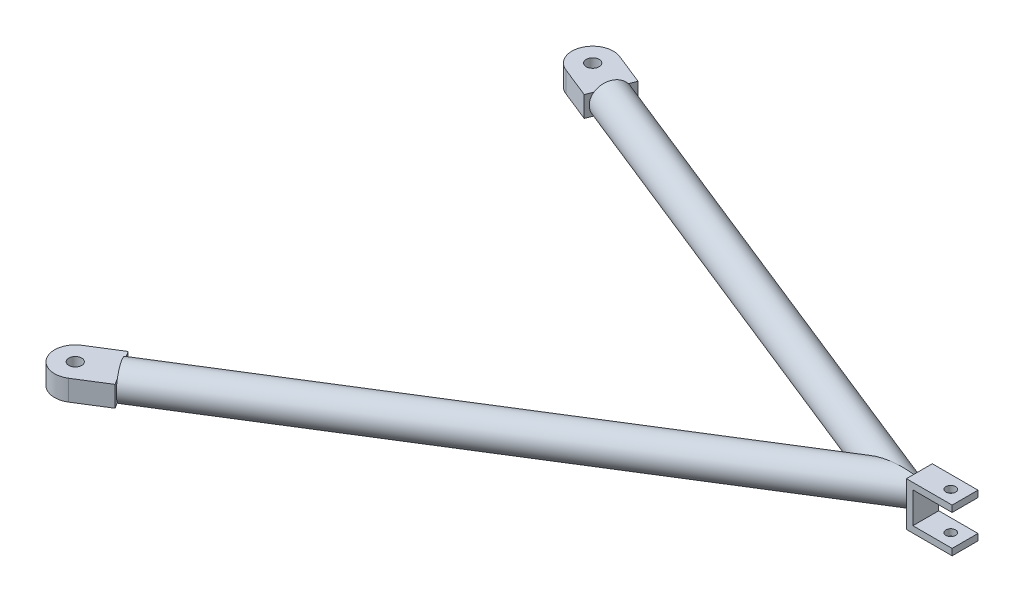
ISO-10303-21;
HEADER;
FILE_DESCRIPTION(('STEP AP214'),'2;1');
FILE_NAME('part.step','',(''),(''),'','','');
FILE_SCHEMA(('AUTOMOTIVE_DESIGN { 1 0 10303 214 1 1 1 1 }'));
ENDSEC;
DATA;
#1=APPLICATION_CONTEXT('core data for automotive mechanical design processes');
#2=APPLICATION_PROTOCOL_DEFINITION('international standard','automotive_design',2000,#1);
#3=PRODUCT_CONTEXT('',#1,'mechanical');
#4=PRODUCT('Part','Part','',(#3));
#5=PRODUCT_RELATED_PRODUCT_CATEGORY('part','',(#4));
#6=PRODUCT_DEFINITION_FORMATION('','',#4);
#7=PRODUCT_DEFINITION_CONTEXT('part definition',#1,'design');
#8=PRODUCT_DEFINITION('design','',#6,#7);
#9=PRODUCT_DEFINITION_SHAPE('','',#8);
#10=(LENGTH_UNIT() NAMED_UNIT(*) SI_UNIT(.MILLI.,.METRE.));
#11=(NAMED_UNIT(*) PLANE_ANGLE_UNIT() SI_UNIT($,.RADIAN.));
#12=(NAMED_UNIT(*) SI_UNIT($,.STERADIAN.) SOLID_ANGLE_UNIT());
#13=UNCERTAINTY_MEASURE_WITH_UNIT(LENGTH_MEASURE(1.E-05),#10,'distance_accuracy_value','');
#14=(GEOMETRIC_REPRESENTATION_CONTEXT(3) GLOBAL_UNCERTAINTY_ASSIGNED_CONTEXT((#13)) GLOBAL_UNIT_ASSIGNED_CONTEXT((#10,
#11,#12)) REPRESENTATION_CONTEXT('',''));
#15=CARTESIAN_POINT('',(0.,0.,0.));
#16=DIRECTION('',(0.,0.,1.));
#17=DIRECTION('',(1.,0.,0.));
#18=AXIS2_PLACEMENT_3D('',#15,#16,#17);
#19=CARTESIAN_POINT('',(-247.620690573304,0.,-99.06));
#20=DIRECTION('',(0.928461531958395,0.,0.371428571428571));
#21=DIRECTION('',(0.371428571428572,0.,-0.928461531958396));
#22=AXIS2_PLACEMENT_3D('',#19,#20,#21);
#23=CYLINDRICAL_SURFACE('',#22,8.25500000000001);
#24=CARTESIAN_POINT('',(11.8110000000001,0.,4.72495919985996));
#25=DIRECTION('',(-1.,0.,0.));
#26=DIRECTION('',(0.,0.,1.));
#27=AXIS2_PLACEMENT_3D('',#24,#25,#26);
#28=ELLIPSE('',#27,8.89105225780094,8.25500000000001);
#29=CARTESIAN_POINT('',(11.8110000000001,-6.27078691992011,-1.05733352724137));
#30=VERTEX_POINT('',#29);
#31=CARTESIAN_POINT('',(11.8110000000001,6.27078691992011,-1.05733352724137));
#32=VERTEX_POINT('',#31);
#33=EDGE_CURVE('E61',#30,#32,#28,.F.);
#34=ORIENTED_EDGE('',*,*,#33,.F.);
#35=CARTESIAN_POINT('',(0.,0.,0.));
#36=DIRECTION('',(0.0891645140120563,0.,0.996016912226391));
#37=DIRECTION('',(0.996016912226391,0.,-0.0891645140120563));
#38=AXIS2_PLACEMENT_3D('',#35,#36,#37);
#39=ELLIPSE('',#38,18.2336261333202,8.25500000000001);
#40=EDGE_CURVE('E225',#30,#32,#39,.F.);
#41=ORIENTED_EDGE('',*,*,#40,.T.);
#42=EDGE_LOOP('',(#34,#41));
#43=FACE_BOUND('',#42,.T.);
#44=CARTESIAN_POINT('',(-232.527619909788,0.,-93.0220571428572));
#45=DIRECTION('',(-0.928461531958395,0.,-0.371428571428572));
#46=DIRECTION('',(-0.371428571428572,0.,0.928461531958395));
#47=AXIS2_PLACEMENT_3D('',#44,#45,#46);
#48=CIRCLE('',#47,8.25500000000001);
#49=CARTESIAN_POINT('',(-234.944436440445,5.08,-86.9807308930058));
#50=VERTEX_POINT('',#49);
#51=CARTESIAN_POINT('',(-234.944436440445,-5.08,-86.9807308930058));
#52=VERTEX_POINT('',#51);
#53=EDGE_CURVE('E44',#50,#52,#48,.F.);
#54=ORIENTED_EDGE('',*,*,#53,.T.);
#55=CARTESIAN_POINT('',(-232.527619909788,0.,-93.0220571428572));
#56=DIRECTION('',(-0.928461531958395,0.,-0.371428571428572));
#57=DIRECTION('',(-0.371428571428572,0.,0.928461531958395));
#58=AXIS2_PLACEMENT_3D('',#55,#56,#57);
#59=CIRCLE('',#58,8.255);
#60=CARTESIAN_POINT('',(-230.110803379131,-5.08,-99.0633833927085));
#61=VERTEX_POINT('',#60);
#62=EDGE_CURVE('E194',#52,#61,#59,.F.);
#63=ORIENTED_EDGE('',*,*,#62,.T.);
#64=CARTESIAN_POINT('',(-230.110803379131,5.08,-99.0633833927085));
#65=VERTEX_POINT('',#64);
#66=EDGE_CURVE('E11',#61,#65,#48,.F.);
#67=ORIENTED_EDGE('',*,*,#66,.T.);
#68=CARTESIAN_POINT('',(-232.527619909788,0.,-93.0220571428572));
#69=DIRECTION('',(-0.928461531958395,0.,-0.371428571428572));
#70=DIRECTION('',(-0.371428571428572,0.,0.928461531958395));
#71=AXIS2_PLACEMENT_3D('',#68,#69,#70);
#72=CIRCLE('',#71,8.255);
#73=EDGE_CURVE('E214',#65,#50,#72,.F.);
#74=ORIENTED_EDGE('',*,*,#73,.T.);
#75=EDGE_LOOP('',(#54,#63,#67,#74));
#76=FACE_BOUND('',#75,.T.);
#77=ADVANCED_FACE('F40',(#43,#76),#23,.T.);
#78=CARTESIAN_POINT('',(15.2452595311789,0.,-9.53918877413676));
#79=DIRECTION('',(-0.847725746570709,0.,0.530434782608696));
#80=DIRECTION('',(0.530434782608696,0.,0.847725746570709));
#81=AXIS2_PLACEMENT_3D('',#78,#79,#80);
#82=CYLINDRICAL_SURFACE('',#81,8.25500000000001);
#83=CARTESIAN_POINT('',(11.8110000000001,0.,-7.39032079978092));
#84=DIRECTION('',(-1.,0.,0.));
#85=DIRECTION('',(0.,0.,1.));
#86=AXIS2_PLACEMENT_3D('',#83,#84,#85);
#87=ELLIPSE('',#86,9.73781913949626,8.25500000000001);
#88=EDGE_CURVE('E227',#32,#30,#87,.F.);
#89=ORIENTED_EDGE('',*,*,#88,.F.);
#90=ORIENTED_EDGE('',*,*,#40,.F.);
#91=EDGE_LOOP('',(#89,#90));
#92=FACE_BOUND('',#91,.T.);
#93=CARTESIAN_POINT('',(-233.624738497422,0.,146.182521739131));
#94=DIRECTION('',(-0.847725746570709,0.,0.530434782608696));
#95=DIRECTION('',(0.530434782608696,0.,0.847725746570709));
#96=AXIS2_PLACEMENT_3D('',#93,#94,#95);
#97=CIRCLE('',#96,8.25500000000001);
#98=CARTESIAN_POINT('',(-230.173298167688,5.08,151.698515271604));
#99=VERTEX_POINT('',#98);
#100=CARTESIAN_POINT('',(-230.173298167688,-5.08,151.698515271604));
#101=VERTEX_POINT('',#100);
#102=EDGE_CURVE('E217',#99,#101,#97,.F.);
#103=ORIENTED_EDGE('',*,*,#102,.T.);
#104=CARTESIAN_POINT('',(-233.624738497422,0.,146.182521739131));
#105=DIRECTION('',(-0.847725746570709,0.,0.530434782608696));
#106=DIRECTION('',(0.530434782608696,0.,0.847725746570709));
#107=AXIS2_PLACEMENT_3D('',#104,#105,#106);
#108=CIRCLE('',#107,8.25500000000002);
#109=CARTESIAN_POINT('',(-237.076178827156,-5.08,140.666528206658));
#110=VERTEX_POINT('',#109);
#111=EDGE_CURVE('E356',#101,#110,#108,.F.);
#112=ORIENTED_EDGE('',*,*,#111,.T.);
#113=CARTESIAN_POINT('',(-237.076178827156,5.08,140.666528206658));
#114=VERTEX_POINT('',#113);
#115=EDGE_CURVE('E215',#110,#114,#97,.F.);
#116=ORIENTED_EDGE('',*,*,#115,.T.);
#117=CARTESIAN_POINT('',(-233.624738497422,0.,146.182521739131));
#118=DIRECTION('',(-0.847725746570709,0.,0.530434782608696));
#119=DIRECTION('',(0.530434782608696,0.,0.847725746570709));
#120=AXIS2_PLACEMENT_3D('',#117,#118,#119);
#121=CIRCLE('',#120,8.25500000000002);
#122=EDGE_CURVE('E193',#114,#99,#121,.F.);
#123=ORIENTED_EDGE('',*,*,#122,.T.);
#124=EDGE_LOOP('',(#103,#112,#116,#123));
#125=FACE_BOUND('',#124,.T.);
#126=ADVANCED_FACE('F42',(#92,#125),#82,.T.);
#127=CARTESIAN_POINT('',(-239.013955888726,-5.08,137.569628153972));
#128=DIRECTION('',(0.,-1.,0.));
#129=DIRECTION('',(0.,0.,-1.));
#130=AXIS2_PLACEMENT_3D('',#127,#128,#129);
#131=PLANE('',#130);
#132=CARTESIAN_POINT('',(-247.620690573304,-5.08,154.94));
#133=DIRECTION('',(0.,-1.,0.));
#134=DIRECTION('',(0.,0.,-1.));
#135=AXIS2_PLACEMENT_3D('',#132,#133,#134);
#136=CIRCLE('',#135,3.175);
#137=CARTESIAN_POINT('',(-247.620690573304,-5.08,151.765));
#138=VERTEX_POINT('',#137);
#139=EDGE_CURVE('E361',#138,#138,#136,.T.);
#140=ORIENTED_EDGE('',*,*,#139,.F.);
#141=EDGE_LOOP('',(#140));
#142=FACE_BOUND('',#141,.T.);
#143=CARTESIAN_POINT('',(-247.620690573304,-5.08,154.94));
#144=DIRECTION('',(0.,-1.,0.));
#145=DIRECTION('',(0.,0.,-1.));
#146=AXIS2_PLACEMENT_3D('',#143,#144,#145);
#147=CIRCLE('',#146,10.16);
#148=CARTESIAN_POINT('',(-253.009907964609,-5.08,146.327106414842));
#149=VERTEX_POINT('',#148);
#150=CARTESIAN_POINT('',(-242.231473182,-5.08,163.552893585159));
#151=VERTEX_POINT('',#150);
#152=EDGE_CURVE('E345',#149,#151,#147,.F.);
#153=ORIENTED_EDGE('',*,*,#152,.F.);
#154=DIRECTION('',(-0.847725746570709,0.,0.530434782608696));
#155=VECTOR('',#154,1.);
#156=CARTESIAN_POINT('',(-239.013955888726,-5.08,137.569628153972));
#157=LINE('',#156,#155);
#158=CARTESIAN_POINT('',(-239.013955888726,-5.08,137.569628153972));
#159=VERTEX_POINT('',#158);
#160=EDGE_CURVE('E301',#159,#149,#157,.T.);
#161=ORIENTED_EDGE('',*,*,#160,.F.);
#162=DIRECTION('',(0.530434782608696,0.,0.847725746570709));
#163=VECTOR('',#162,1.);
#164=CARTESIAN_POINT('',(-239.013955888726,-5.08,137.569628153972));
#165=LINE('',#164,#163);
#166=EDGE_CURVE('E298',#159,#110,#165,.T.);
#167=ORIENTED_EDGE('',*,*,#166,.T.);
#168=DIRECTION('',(0.530434782608696,0.,0.847725746570709));
#169=VECTOR('',#168,1.);
#170=CARTESIAN_POINT('',(-230.173298167688,-5.08,151.698515271604));
#171=LINE('',#170,#169);
#172=EDGE_CURVE('E54',#110,#101,#171,.T.);
#173=ORIENTED_EDGE('',*,*,#172,.T.);
#174=CARTESIAN_POINT('',(-228.235521106118,-5.08,154.795415324289));
#175=VERTEX_POINT('',#174);
#176=EDGE_CURVE('E308',#101,#175,#165,.T.);
#177=ORIENTED_EDGE('',*,*,#176,.T.);
#178=DIRECTION('',(-0.847725746570709,0.,0.530434782608696));
#179=VECTOR('',#178,1.);
#180=CARTESIAN_POINT('',(-228.235521106118,-5.08,154.795415324289));
#181=LINE('',#180,#179);
#182=EDGE_CURVE('E293',#175,#151,#181,.T.);
#183=ORIENTED_EDGE('',*,*,#182,.T.);
#184=EDGE_LOOP('',(#153,#161,#167,#173,#177,#183));
#185=FACE_BOUND('',#184,.T.);
#186=ADVANCED_FACE('F443',(#142,#185),#131,.T.);
#187=CARTESIAN_POINT('',(-239.013955888726,5.08,137.569628153972));
#188=DIRECTION('',(-0.530434782608696,0.,-0.847725746570709));
#189=DIRECTION('',(-0.847725746570709,0.,0.530434782608696));
#190=AXIS2_PLACEMENT_3D('',#187,#188,#189);
#191=PLANE('',#190);
#192=ORIENTED_EDGE('',*,*,#160,.T.);
#193=DIRECTION('',(0.,1.,0.));
#194=VECTOR('',#193,1.);
#195=CARTESIAN_POINT('',(-253.009907964609,-10.795,146.327106414842));
#196=LINE('',#195,#194);
#197=CARTESIAN_POINT('',(-253.009907964609,5.08,146.327106414842));
#198=VERTEX_POINT('',#197);
#199=EDGE_CURVE('E351',#149,#198,#196,.T.);
#200=ORIENTED_EDGE('',*,*,#199,.T.);
#201=DIRECTION('',(-0.847725746570709,0.,0.530434782608696));
#202=VECTOR('',#201,1.);
#203=CARTESIAN_POINT('',(-239.013955888726,5.08,137.569628153972));
#204=LINE('',#203,#202);
#205=CARTESIAN_POINT('',(-239.013955888726,5.08,137.569628153972));
#206=VERTEX_POINT('',#205);
#207=EDGE_CURVE('E297',#206,#198,#204,.T.);
#208=ORIENTED_EDGE('',*,*,#207,.F.);
#209=DIRECTION('',(0.,-1.,0.));
#210=VECTOR('',#209,1.);
#211=CARTESIAN_POINT('',(-239.013955888726,5.08,137.569628153972));
#212=LINE('',#211,#210);
#213=EDGE_CURVE('E309',#206,#159,#212,.T.);
#214=ORIENTED_EDGE('',*,*,#213,.T.);
#215=EDGE_LOOP('',(#192,#200,#208,#214));
#216=FACE_BOUND('',#215,.T.);
#217=ADVANCED_FACE('F526',(#216),#191,.T.);
#218=CARTESIAN_POINT('',(-239.013955888726,5.08,137.569628153972));
#219=DIRECTION('',(0.,1.,0.));
#220=DIRECTION('',(0.,0.,1.));
#221=AXIS2_PLACEMENT_3D('',#218,#219,#220);
#222=PLANE('',#221);
#223=CARTESIAN_POINT('',(-247.620690573304,5.08,154.94));
#224=DIRECTION('',(0.,1.,0.));
#225=DIRECTION('',(0.,0.,1.));
#226=AXIS2_PLACEMENT_3D('',#223,#224,#225);
#227=CIRCLE('',#226,3.17500000000001);
#228=CARTESIAN_POINT('',(-247.620690573304,5.08,158.115));
#229=VERTEX_POINT('',#228);
#230=EDGE_CURVE('E365',#229,#229,#227,.T.);
#231=ORIENTED_EDGE('',*,*,#230,.F.);
#232=EDGE_LOOP('',(#231));
#233=FACE_BOUND('',#232,.T.);
#234=DIRECTION('',(-0.530434782608696,0.,-0.847725746570709));
#235=VECTOR('',#234,1.);
#236=CARTESIAN_POINT('',(-237.076178827156,5.08,140.666528206658));
#237=LINE('',#236,#235);
#238=EDGE_CURVE('E354',#99,#114,#237,.T.);
#239=ORIENTED_EDGE('',*,*,#238,.T.);
#240=DIRECTION('',(-0.530434782608696,0.,-0.847725746570709));
#241=VECTOR('',#240,1.);
#242=CARTESIAN_POINT('',(-239.013955888726,5.08,137.569628153972));
#243=LINE('',#242,#241);
#244=EDGE_CURVE('E315',#114,#206,#243,.T.);
#245=ORIENTED_EDGE('',*,*,#244,.T.);
#246=ORIENTED_EDGE('',*,*,#207,.T.);
#247=CARTESIAN_POINT('',(-247.620690573304,5.08,154.94));
#248=DIRECTION('',(0.,-1.,0.));
#249=DIRECTION('',(0.,0.,1.));
#250=AXIS2_PLACEMENT_3D('',#247,#248,#249);
#251=CIRCLE('',#250,10.16);
#252=CARTESIAN_POINT('',(-242.231473182,5.08,163.552893585159));
#253=VERTEX_POINT('',#252);
#254=EDGE_CURVE('E349',#253,#198,#251,.T.);
#255=ORIENTED_EDGE('',*,*,#254,.F.);
#256=DIRECTION('',(-0.847725746570709,0.,0.530434782608696));
#257=VECTOR('',#256,1.);
#258=CARTESIAN_POINT('',(-228.235521106118,5.08,154.795415324289));
#259=LINE('',#258,#257);
#260=CARTESIAN_POINT('',(-228.235521106118,5.08,154.795415324289));
#261=VERTEX_POINT('',#260);
#262=EDGE_CURVE('E294',#261,#253,#259,.T.);
#263=ORIENTED_EDGE('',*,*,#262,.F.);
#264=EDGE_CURVE('E312',#261,#99,#243,.T.);
#265=ORIENTED_EDGE('',*,*,#264,.T.);
#266=EDGE_LOOP('',(#239,#245,#246,#255,#263,#265));
#267=FACE_BOUND('',#266,.T.);
#268=ADVANCED_FACE('F530',(#233,#267),#222,.T.);
#269=CARTESIAN_POINT('',(-228.235521106118,5.08,154.795415324289));
#270=DIRECTION('',(0.530434782608696,0.,0.847725746570709));
#271=DIRECTION('',(0.847725746570709,0.,-0.530434782608696));
#272=AXIS2_PLACEMENT_3D('',#269,#270,#271);
#273=PLANE('',#272);
#274=ORIENTED_EDGE('',*,*,#262,.T.);
#275=DIRECTION('',(0.,1.,0.));
#276=VECTOR('',#275,1.);
#277=CARTESIAN_POINT('',(-242.231473182,-10.795,163.552893585159));
#278=LINE('',#277,#276);
#279=EDGE_CURVE('E347',#151,#253,#278,.T.);
#280=ORIENTED_EDGE('',*,*,#279,.F.);
#281=ORIENTED_EDGE('',*,*,#182,.F.);
#282=DIRECTION('',(0.,1.,0.));
#283=VECTOR('',#282,1.);
#284=CARTESIAN_POINT('',(-228.235521106118,5.08,154.795415324289));
#285=LINE('',#284,#283);
#286=EDGE_CURVE('E316',#175,#261,#285,.T.);
#287=ORIENTED_EDGE('',*,*,#286,.T.);
#288=EDGE_LOOP('',(#274,#280,#281,#287));
#289=FACE_BOUND('',#288,.T.);
#290=ADVANCED_FACE('F508',(#289),#273,.T.);
#291=CARTESIAN_POINT('',(-228.753905624074,-5.08,-102.455226307554));
#292=DIRECTION('',(0.,-1.,0.));
#293=DIRECTION('',(0.,0.,-1.));
#294=AXIS2_PLACEMENT_3D('',#291,#292,#293);
#295=PLANE('',#294);
#296=CARTESIAN_POINT('',(-247.620690573304,-5.08,-99.06));
#297=DIRECTION('',(0.,-1.,0.));
#298=DIRECTION('',(0.,0.,-1.));
#299=AXIS2_PLACEMENT_3D('',#296,#297,#298);
#300=CIRCLE('',#299,3.175);
#301=CARTESIAN_POINT('',(-247.620690573304,-5.08,-102.235));
#302=VERTEX_POINT('',#301);
#303=EDGE_CURVE('E368',#302,#302,#300,.T.);
#304=ORIENTED_EDGE('',*,*,#303,.F.);
#305=EDGE_LOOP('',(#304));
#306=FACE_BOUND('',#305,.T.);
#307=DIRECTION('',(-0.371428571428572,0.,0.928461531958395));
#308=VECTOR('',#307,1.);
#309=CARTESIAN_POINT('',(-234.944436440445,-5.08,-86.9807308930059));
#310=LINE('',#309,#308);
#311=EDGE_CURVE('E182',#61,#52,#310,.T.);
#312=ORIENTED_EDGE('',*,*,#311,.T.);
#313=DIRECTION('',(-0.371428571428572,0.,0.928461531958395));
#314=VECTOR('',#313,1.);
#315=CARTESIAN_POINT('',(-228.753905624074,-5.08,-102.455226307554));
#316=LINE('',#315,#314);
#317=CARTESIAN_POINT('',(-236.301334195503,-5.08,-83.5888879781599));
#318=VERTEX_POINT('',#317);
#319=EDGE_CURVE('E187',#52,#318,#316,.T.);
#320=ORIENTED_EDGE('',*,*,#319,.T.);
#321=DIRECTION('',(-0.928461531958396,0.,-0.371428571428572));
#322=VECTOR('',#321,1.);
#323=CARTESIAN_POINT('',(-236.301334195503,-5.08,-83.5888879781599));
#324=LINE('',#323,#322);
#325=CARTESIAN_POINT('',(-251.394404859018,-5.08,-89.6268308353027));
#326=VERTEX_POINT('',#325);
#327=EDGE_CURVE('E319',#318,#326,#324,.T.);
#328=ORIENTED_EDGE('',*,*,#327,.T.);
#329=CARTESIAN_POINT('',(-247.620690573304,-5.08,-99.06));
#330=DIRECTION('',(0.,-1.,0.));
#331=DIRECTION('',(0.,0.,-1.));
#332=AXIS2_PLACEMENT_3D('',#329,#330,#331);
#333=CIRCLE('',#332,10.16);
#334=CARTESIAN_POINT('',(-243.84697628759,-5.08,-108.493169164697));
#335=VERTEX_POINT('',#334);
#336=EDGE_CURVE('E336',#335,#326,#333,.F.);
#337=ORIENTED_EDGE('',*,*,#336,.F.);
#338=DIRECTION('',(-0.928461531958396,0.,-0.371428571428572));
#339=VECTOR('',#338,1.);
#340=CARTESIAN_POINT('',(-228.753905624074,-5.08,-102.455226307554));
#341=LINE('',#340,#339);
#342=CARTESIAN_POINT('',(-228.753905624074,-5.08,-102.455226307554));
#343=VERTEX_POINT('',#342);
#344=EDGE_CURVE('E326',#343,#335,#341,.T.);
#345=ORIENTED_EDGE('',*,*,#344,.F.);
#346=EDGE_CURVE('E190',#343,#61,#316,.T.);
#347=ORIENTED_EDGE('',*,*,#346,.T.);
#348=EDGE_LOOP('',(#312,#320,#328,#337,#345,#347));
#349=FACE_BOUND('',#348,.T.);
#350=ADVANCED_FACE('F184',(#306,#349),#295,.T.);
#351=CARTESIAN_POINT('',(-228.753905624074,5.08,-102.455226307554));
#352=DIRECTION('',(0.371428571428572,0.,-0.928461531958396));
#353=DIRECTION('',(-0.928461531958396,0.,-0.371428571428572));
#354=AXIS2_PLACEMENT_3D('',#351,#352,#353);
#355=PLANE('',#354);
#356=ORIENTED_EDGE('',*,*,#344,.T.);
#357=DIRECTION('',(0.,1.,0.));
#358=VECTOR('',#357,1.);
#359=CARTESIAN_POINT('',(-243.84697628759,-10.795,-108.493169164697));
#360=LINE('',#359,#358);
#361=CARTESIAN_POINT('',(-243.84697628759,5.08,-108.493169164697));
#362=VERTEX_POINT('',#361);
#363=EDGE_CURVE('E342',#335,#362,#360,.T.);
#364=ORIENTED_EDGE('',*,*,#363,.T.);
#365=DIRECTION('',(-0.928461531958396,0.,-0.371428571428572));
#366=VECTOR('',#365,1.);
#367=CARTESIAN_POINT('',(-228.753905624074,5.08,-102.455226307554));
#368=LINE('',#367,#366);
#369=CARTESIAN_POINT('',(-228.753905624074,5.08,-102.455226307554));
#370=VERTEX_POINT('',#369);
#371=EDGE_CURVE('E323',#370,#362,#368,.T.);
#372=ORIENTED_EDGE('',*,*,#371,.F.);
#373=DIRECTION('',(0.,-1.,0.));
#374=VECTOR('',#373,1.);
#375=CARTESIAN_POINT('',(-228.753905624074,5.08,-102.455226307554));
#376=LINE('',#375,#374);
#377=EDGE_CURVE('E210',#370,#343,#376,.T.);
#378=ORIENTED_EDGE('',*,*,#377,.T.);
#379=EDGE_LOOP('',(#356,#364,#372,#378));
#380=FACE_BOUND('',#379,.T.);
#381=ADVANCED_FACE('F507',(#380),#355,.T.);
#382=CARTESIAN_POINT('',(-228.753905624074,5.08,-102.455226307554));
#383=DIRECTION('',(0.,1.,0.));
#384=DIRECTION('',(0.,0.,1.));
#385=AXIS2_PLACEMENT_3D('',#382,#383,#384);
#386=PLANE('',#385);
#387=CARTESIAN_POINT('',(-247.620690573304,5.08,-99.06));
#388=DIRECTION('',(0.,1.,0.));
#389=DIRECTION('',(0.,0.,1.));
#390=AXIS2_PLACEMENT_3D('',#387,#388,#389);
#391=CIRCLE('',#390,3.17500000000001);
#392=CARTESIAN_POINT('',(-247.620690573304,5.08,-95.885));
#393=VERTEX_POINT('',#392);
#394=EDGE_CURVE('E371',#393,#393,#391,.T.);
#395=ORIENTED_EDGE('',*,*,#394,.F.);
#396=EDGE_LOOP('',(#395));
#397=FACE_BOUND('',#396,.T.);
#398=DIRECTION('',(0.371428571428572,0.,-0.928461531958395));
#399=VECTOR('',#398,1.);
#400=CARTESIAN_POINT('',(-230.110803379131,5.08,-99.0633833927085));
#401=LINE('',#400,#399);
#402=EDGE_CURVE('E200',#50,#65,#401,.T.);
#403=ORIENTED_EDGE('',*,*,#402,.T.);
#404=DIRECTION('',(0.371428571428572,0.,-0.928461531958395));
#405=VECTOR('',#404,1.);
#406=CARTESIAN_POINT('',(-228.753905624074,5.08,-102.455226307554));
#407=LINE('',#406,#405);
#408=EDGE_CURVE('E334',#65,#370,#407,.T.);
#409=ORIENTED_EDGE('',*,*,#408,.T.);
#410=ORIENTED_EDGE('',*,*,#371,.T.);
#411=CARTESIAN_POINT('',(-247.620690573304,5.08,-99.06));
#412=DIRECTION('',(0.,-1.,0.));
#413=DIRECTION('',(0.,0.,1.));
#414=AXIS2_PLACEMENT_3D('',#411,#412,#413);
#415=CIRCLE('',#414,10.16);
#416=CARTESIAN_POINT('',(-251.394404859018,5.08,-89.6268308353027));
#417=VERTEX_POINT('',#416);
#418=EDGE_CURVE('E340',#417,#362,#415,.T.);
#419=ORIENTED_EDGE('',*,*,#418,.F.);
#420=DIRECTION('',(-0.928461531958396,0.,-0.371428571428572));
#421=VECTOR('',#420,1.);
#422=CARTESIAN_POINT('',(-236.301334195503,5.08,-83.5888879781599));
#423=LINE('',#422,#421);
#424=CARTESIAN_POINT('',(-236.301334195503,5.08,-83.5888879781599));
#425=VERTEX_POINT('',#424);
#426=EDGE_CURVE('E320',#425,#417,#423,.T.);
#427=ORIENTED_EDGE('',*,*,#426,.F.);
#428=EDGE_CURVE('E332',#425,#50,#407,.T.);
#429=ORIENTED_EDGE('',*,*,#428,.T.);
#430=EDGE_LOOP('',(#403,#409,#410,#419,#427,#429));
#431=FACE_BOUND('',#430,.T.);
#432=ADVANCED_FACE('F512',(#397,#431),#386,.T.);
#433=CARTESIAN_POINT('',(-236.301334195503,5.08,-83.5888879781599));
#434=DIRECTION('',(-0.371428571428572,0.,0.928461531958396));
#435=DIRECTION('',(0.928461531958396,0.,0.371428571428572));
#436=AXIS2_PLACEMENT_3D('',#433,#434,#435);
#437=PLANE('',#436);
#438=ORIENTED_EDGE('',*,*,#426,.T.);
#439=DIRECTION('',(0.,1.,0.));
#440=VECTOR('',#439,1.);
#441=CARTESIAN_POINT('',(-251.394404859018,-10.795,-89.6268308353027));
#442=LINE('',#441,#440);
#443=EDGE_CURVE('E338',#326,#417,#442,.T.);
#444=ORIENTED_EDGE('',*,*,#443,.F.);
#445=ORIENTED_EDGE('',*,*,#327,.F.);
#446=DIRECTION('',(0.,1.,0.));
#447=VECTOR('',#446,1.);
#448=CARTESIAN_POINT('',(-236.301334195503,5.08,-83.5888879781599));
#449=LINE('',#448,#447);
#450=EDGE_CURVE('E209',#318,#425,#449,.T.);
#451=ORIENTED_EDGE('',*,*,#450,.T.);
#452=EDGE_LOOP('',(#438,#444,#445,#451));
#453=FACE_BOUND('',#452,.T.);
#454=ADVANCED_FACE('F447',(#453),#437,.T.);
#455=CARTESIAN_POINT('',(34.2566729305824,-7.62,-6.35));
#456=DIRECTION('',(1.,0.,0.));
#457=DIRECTION('',(0.,1.,0.));
#458=AXIS2_PLACEMENT_3D('',#455,#456,#457);
#459=PLANE('',#458);
#460=DIRECTION('',(0.,0.,1.));
#461=VECTOR('',#460,1.);
#462=CARTESIAN_POINT('',(34.2566729305824,-7.62,-6.35));
#463=LINE('',#462,#461);
#464=CARTESIAN_POINT('',(34.2566729305824,-7.62,-6.35));
#465=VERTEX_POINT('',#464);
#466=CARTESIAN_POINT('',(34.2566729305824,-7.62,6.35));
#467=VERTEX_POINT('',#466);
#468=EDGE_CURVE('E231',#465,#467,#463,.T.);
#469=ORIENTED_EDGE('',*,*,#468,.T.);
#470=DIRECTION('',(0.,1.,0.));
#471=VECTOR('',#470,1.);
#472=CARTESIAN_POINT('',(34.2566729305824,-7.62,6.35));
#473=LINE('',#472,#471);
#474=CARTESIAN_POINT('',(34.2566729305824,-10.795,6.35));
#475=VERTEX_POINT('',#474);
#476=EDGE_CURVE('E290',#475,#467,#473,.T.);
#477=ORIENTED_EDGE('',*,*,#476,.F.);
#478=DIRECTION('',(0.,0.,1.));
#479=VECTOR('',#478,1.);
#480=CARTESIAN_POINT('',(34.2566729305824,-10.795,-6.35));
#481=LINE('',#480,#479);
#482=CARTESIAN_POINT('',(34.2566729305824,-10.795,-6.35));
#483=VERTEX_POINT('',#482);
#484=EDGE_CURVE('E230',#483,#475,#481,.T.);
#485=ORIENTED_EDGE('',*,*,#484,.F.);
#486=DIRECTION('',(0.,1.,0.));
#487=VECTOR('',#486,1.);
#488=CARTESIAN_POINT('',(34.2566729305824,-7.62,-6.35));
#489=LINE('',#488,#487);
#490=EDGE_CURVE('E267',#483,#465,#489,.T.);
#491=ORIENTED_EDGE('',*,*,#490,.T.);
#492=EDGE_LOOP('',(#469,#477,#485,#491));
#493=FACE_BOUND('',#492,.T.);
#494=ADVANCED_FACE('F409',(#493),#459,.T.);
#495=CARTESIAN_POINT('',(34.2566729305824,-10.795,-6.35));
#496=DIRECTION('',(0.,-1.,0.));
#497=DIRECTION('',(1.,0.,0.));
#498=AXIS2_PLACEMENT_3D('',#495,#496,#497);
#499=PLANE('',#498);
#500=CARTESIAN_POINT('',(27.2415233236645,-10.795,0.));
#501=DIRECTION('',(0.,1.,0.));
#502=DIRECTION('',(0.,0.,1.));
#503=AXIS2_PLACEMENT_3D('',#500,#501,#502);
#504=CIRCLE('',#503,2.38124999999999);
#505=CARTESIAN_POINT('',(27.2415233236645,-10.795,2.38124999999999));
#506=VERTEX_POINT('',#505);
#507=EDGE_CURVE('E380',#506,#506,#504,.T.);
#508=ORIENTED_EDGE('',*,*,#507,.T.);
#509=EDGE_LOOP('',(#508));
#510=FACE_BOUND('',#509,.T.);
#511=ORIENTED_EDGE('',*,*,#484,.T.);
#512=DIRECTION('',(1.,0.,0.));
#513=VECTOR('',#512,1.);
#514=CARTESIAN_POINT('',(34.2566729305824,-10.795,6.35));
#515=LINE('',#514,#513);
#516=CARTESIAN_POINT('',(11.8110000000001,-10.795,6.35));
#517=VERTEX_POINT('',#516);
#518=EDGE_CURVE('E270',#517,#475,#515,.T.);
#519=ORIENTED_EDGE('',*,*,#518,.F.);
#520=DIRECTION('',(0.,0.,1.));
#521=VECTOR('',#520,1.);
#522=CARTESIAN_POINT('',(11.8110000000001,-10.795,-6.35));
#523=LINE('',#522,#521);
#524=CARTESIAN_POINT('',(11.8110000000001,-10.795,-6.35));
#525=VERTEX_POINT('',#524);
#526=EDGE_CURVE('E245',#525,#517,#523,.T.);
#527=ORIENTED_EDGE('',*,*,#526,.F.);
#528=DIRECTION('',(1.,0.,0.));
#529=VECTOR('',#528,1.);
#530=CARTESIAN_POINT('',(34.2566729305824,-10.795,-6.35));
#531=LINE('',#530,#529);
#532=EDGE_CURVE('E234',#525,#483,#531,.T.);
#533=ORIENTED_EDGE('',*,*,#532,.T.);
#534=EDGE_LOOP('',(#511,#519,#527,#533));
#535=FACE_BOUND('',#534,.T.);
#536=ADVANCED_FACE('F406',(#510,#535),#499,.T.);
#537=CARTESIAN_POINT('',(11.8110000000001,-10.795,-6.35));
#538=DIRECTION('',(-1.,0.,0.));
#539=DIRECTION('',(0.,0.,1.));
#540=AXIS2_PLACEMENT_3D('',#537,#538,#539);
#541=PLANE('',#540);
#542=ORIENTED_EDGE('',*,*,#33,.T.);
#543=ORIENTED_EDGE('',*,*,#88,.T.);
#544=EDGE_LOOP('',(#542,#543));
#545=FACE_BOUND('',#544,.T.);
#546=ORIENTED_EDGE('',*,*,#526,.T.);
#547=DIRECTION('',(0.,-1.,0.));
#548=VECTOR('',#547,1.);
#549=CARTESIAN_POINT('',(11.8110000000001,-10.795,6.35));
#550=LINE('',#549,#548);
#551=CARTESIAN_POINT('',(11.8110000000001,10.795,6.35));
#552=VERTEX_POINT('',#551);
#553=EDGE_CURVE('E273',#552,#517,#550,.T.);
#554=ORIENTED_EDGE('',*,*,#553,.F.);
#555=DIRECTION('',(0.,0.,1.));
#556=VECTOR('',#555,1.);
#557=CARTESIAN_POINT('',(11.8110000000001,10.795,-6.35));
#558=LINE('',#557,#556);
#559=CARTESIAN_POINT('',(11.8110000000001,10.795,-6.35));
#560=VERTEX_POINT('',#559);
#561=EDGE_CURVE('E243',#560,#552,#558,.T.);
#562=ORIENTED_EDGE('',*,*,#561,.F.);
#563=DIRECTION('',(0.,-1.,0.));
#564=VECTOR('',#563,1.);
#565=CARTESIAN_POINT('',(11.8110000000001,-10.795,-6.35));
#566=LINE('',#565,#564);
#567=EDGE_CURVE('E250',#560,#525,#566,.T.);
#568=ORIENTED_EDGE('',*,*,#567,.T.);
#569=EDGE_LOOP('',(#546,#554,#562,#568));
#570=FACE_BOUND('',#569,.T.);
#571=ADVANCED_FACE('F393',(#545,#570),#541,.T.);
#572=CARTESIAN_POINT('',(11.8110000000001,10.795,-6.35));
#573=DIRECTION('',(0.,1.,0.));
#574=DIRECTION('',(-1.,0.,0.));
#575=AXIS2_PLACEMENT_3D('',#572,#573,#574);
#576=PLANE('',#575);
#577=CARTESIAN_POINT('',(27.2415233236645,10.795,0.));
#578=DIRECTION('',(0.,1.,0.));
#579=DIRECTION('',(0.,0.,1.));
#580=AXIS2_PLACEMENT_3D('',#577,#578,#579);
#581=CIRCLE('',#580,2.38124999999999);
#582=CARTESIAN_POINT('',(27.2415233236645,10.795,2.38124999999999));
#583=VERTEX_POINT('',#582);
#584=EDGE_CURVE('E383',#583,#583,#581,.T.);
#585=ORIENTED_EDGE('',*,*,#584,.F.);
#586=EDGE_LOOP('',(#585));
#587=FACE_BOUND('',#586,.T.);
#588=ORIENTED_EDGE('',*,*,#561,.T.);
#589=DIRECTION('',(-1.,0.,0.));
#590=VECTOR('',#589,1.);
#591=CARTESIAN_POINT('',(11.8110000000001,10.795,6.35));
#592=LINE('',#591,#590);
#593=CARTESIAN_POINT('',(34.2566729305824,10.795,6.35));
#594=VERTEX_POINT('',#593);
#595=EDGE_CURVE('E276',#594,#552,#592,.T.);
#596=ORIENTED_EDGE('',*,*,#595,.F.);
#597=DIRECTION('',(0.,0.,1.));
#598=VECTOR('',#597,1.);
#599=CARTESIAN_POINT('',(34.2566729305824,10.795,-6.35));
#600=LINE('',#599,#598);
#601=CARTESIAN_POINT('',(34.2566729305824,10.795,-6.35));
#602=VERTEX_POINT('',#601);
#603=EDGE_CURVE('E241',#602,#594,#600,.T.);
#604=ORIENTED_EDGE('',*,*,#603,.F.);
#605=DIRECTION('',(-1.,0.,0.));
#606=VECTOR('',#605,1.);
#607=CARTESIAN_POINT('',(11.8110000000001,10.795,-6.35));
#608=LINE('',#607,#606);
#609=EDGE_CURVE('E253',#602,#560,#608,.T.);
#610=ORIENTED_EDGE('',*,*,#609,.T.);
#611=EDGE_LOOP('',(#588,#596,#604,#610));
#612=FACE_BOUND('',#611,.T.);
#613=ADVANCED_FACE('F389',(#587,#612),#576,.T.);
#614=CARTESIAN_POINT('',(34.2566729305824,10.795,-6.35));
#615=DIRECTION('',(1.,0.,0.));
#616=DIRECTION('',(0.,1.,0.));
#617=AXIS2_PLACEMENT_3D('',#614,#615,#616);
#618=PLANE('',#617);
#619=ORIENTED_EDGE('',*,*,#603,.T.);
#620=DIRECTION('',(0.,1.,0.));
#621=VECTOR('',#620,1.);
#622=CARTESIAN_POINT('',(34.2566729305824,10.795,6.35));
#623=LINE('',#622,#621);
#624=CARTESIAN_POINT('',(34.2566729305824,7.62,6.35));
#625=VERTEX_POINT('',#624);
#626=EDGE_CURVE('E279',#625,#594,#623,.T.);
#627=ORIENTED_EDGE('',*,*,#626,.F.);
#628=DIRECTION('',(0.,0.,1.));
#629=VECTOR('',#628,1.);
#630=CARTESIAN_POINT('',(34.2566729305824,7.62,-6.35));
#631=LINE('',#630,#629);
#632=CARTESIAN_POINT('',(34.2566729305824,7.62,-6.35));
#633=VERTEX_POINT('',#632);
#634=EDGE_CURVE('E239',#633,#625,#631,.T.);
#635=ORIENTED_EDGE('',*,*,#634,.F.);
#636=DIRECTION('',(0.,1.,0.));
#637=VECTOR('',#636,1.);
#638=CARTESIAN_POINT('',(34.2566729305824,10.795,-6.35));
#639=LINE('',#638,#637);
#640=EDGE_CURVE('E256',#633,#602,#639,.T.);
#641=ORIENTED_EDGE('',*,*,#640,.T.);
#642=EDGE_LOOP('',(#619,#627,#635,#641));
#643=FACE_BOUND('',#642,.T.);
#644=ADVANCED_FACE('F392',(#643),#618,.T.);
#645=CARTESIAN_POINT('',(34.2566729305824,7.62,-6.35));
#646=DIRECTION('',(0.,-1.,0.));
#647=DIRECTION('',(0.,0.,-1.));
#648=AXIS2_PLACEMENT_3D('',#645,#646,#647);
#649=PLANE('',#648);
#650=CARTESIAN_POINT('',(27.2415233236645,7.62,0.));
#651=DIRECTION('',(0.,-1.,0.));
#652=DIRECTION('',(0.,0.,-1.));
#653=AXIS2_PLACEMENT_3D('',#650,#651,#652);
#654=CIRCLE('',#653,2.38124999999999);
#655=CARTESIAN_POINT('',(27.2415233236645,7.62,-2.38124999999999));
#656=VERTEX_POINT('',#655);
#657=EDGE_CURVE('E374',#656,#656,#654,.T.);
#658=ORIENTED_EDGE('',*,*,#657,.F.);
#659=EDGE_LOOP('',(#658));
#660=FACE_BOUND('',#659,.T.);
#661=ORIENTED_EDGE('',*,*,#634,.T.);
#662=DIRECTION('',(1.,0.,0.));
#663=VECTOR('',#662,1.);
#664=CARTESIAN_POINT('',(34.2566729305824,7.62,6.35));
#665=LINE('',#664,#663);
#666=CARTESIAN_POINT('',(14.986,7.62,6.35));
#667=VERTEX_POINT('',#666);
#668=EDGE_CURVE('E282',#667,#625,#665,.T.);
#669=ORIENTED_EDGE('',*,*,#668,.F.);
#670=DIRECTION('',(0.,0.,1.));
#671=VECTOR('',#670,1.);
#672=CARTESIAN_POINT('',(14.986,7.62,-6.35));
#673=LINE('',#672,#671);
#674=CARTESIAN_POINT('',(14.986,7.62,-6.35));
#675=VERTEX_POINT('',#674);
#676=EDGE_CURVE('E236',#675,#667,#673,.T.);
#677=ORIENTED_EDGE('',*,*,#676,.F.);
#678=DIRECTION('',(1.,0.,0.));
#679=VECTOR('',#678,1.);
#680=CARTESIAN_POINT('',(34.2566729305824,7.62,-6.35));
#681=LINE('',#680,#679);
#682=EDGE_CURVE('E259',#675,#633,#681,.T.);
#683=ORIENTED_EDGE('',*,*,#682,.T.);
#684=EDGE_LOOP('',(#661,#669,#677,#683));
#685=FACE_BOUND('',#684,.T.);
#686=ADVANCED_FACE('F423',(#660,#685),#649,.T.);
#687=CARTESIAN_POINT('',(14.986,7.62,-6.35));
#688=DIRECTION('',(1.,0.,0.));
#689=DIRECTION('',(0.,0.,-1.));
#690=AXIS2_PLACEMENT_3D('',#687,#688,#689);
#691=PLANE('',#690);
#692=ORIENTED_EDGE('',*,*,#676,.T.);
#693=DIRECTION('',(0.,1.,0.));
#694=VECTOR('',#693,1.);
#695=CARTESIAN_POINT('',(14.986,7.62,6.35));
#696=LINE('',#695,#694);
#697=CARTESIAN_POINT('',(14.986,-7.62,6.35));
#698=VERTEX_POINT('',#697);
#699=EDGE_CURVE('E285',#698,#667,#696,.T.);
#700=ORIENTED_EDGE('',*,*,#699,.F.);
#701=DIRECTION('',(0.,0.,1.));
#702=VECTOR('',#701,1.);
#703=CARTESIAN_POINT('',(14.986,-7.62,-6.35));
#704=LINE('',#703,#702);
#705=CARTESIAN_POINT('',(14.986,-7.62,-6.35));
#706=VERTEX_POINT('',#705);
#707=EDGE_CURVE('E233',#706,#698,#704,.T.);
#708=ORIENTED_EDGE('',*,*,#707,.F.);
#709=DIRECTION('',(0.,1.,0.));
#710=VECTOR('',#709,1.);
#711=CARTESIAN_POINT('',(14.986,7.62,-6.35));
#712=LINE('',#711,#710);
#713=EDGE_CURVE('E262',#706,#675,#712,.T.);
#714=ORIENTED_EDGE('',*,*,#713,.T.);
#715=EDGE_LOOP('',(#692,#700,#708,#714));
#716=FACE_BOUND('',#715,.T.);
#717=ADVANCED_FACE('F417',(#716),#691,.T.);
#718=CARTESIAN_POINT('',(14.986,-7.62,-6.35));
#719=DIRECTION('',(0.,1.,0.));
#720=DIRECTION('',(0.,0.,1.));
#721=AXIS2_PLACEMENT_3D('',#718,#719,#720);
#722=PLANE('',#721);
#723=CARTESIAN_POINT('',(27.2415233236645,-7.62,0.));
#724=DIRECTION('',(0.,1.,0.));
#725=DIRECTION('',(0.,0.,1.));
#726=AXIS2_PLACEMENT_3D('',#723,#724,#725);
#727=CIRCLE('',#726,2.38124999999999);
#728=CARTESIAN_POINT('',(27.2415233236645,-7.62,2.38124999999999));
#729=VERTEX_POINT('',#728);
#730=EDGE_CURVE('E377',#729,#729,#727,.T.);
#731=ORIENTED_EDGE('',*,*,#730,.F.);
#732=EDGE_LOOP('',(#731));
#733=FACE_BOUND('',#732,.T.);
#734=ORIENTED_EDGE('',*,*,#707,.T.);
#735=DIRECTION('',(-1.,0.,0.));
#736=VECTOR('',#735,1.);
#737=CARTESIAN_POINT('',(14.986,-7.62,6.35));
#738=LINE('',#737,#736);
#739=EDGE_CURVE('E287',#467,#698,#738,.T.);
#740=ORIENTED_EDGE('',*,*,#739,.F.);
#741=ORIENTED_EDGE('',*,*,#468,.F.);
#742=DIRECTION('',(-1.,0.,0.));
#743=VECTOR('',#742,1.);
#744=CARTESIAN_POINT('',(14.986,-7.62,-6.35));
#745=LINE('',#744,#743);
#746=EDGE_CURVE('E264',#465,#706,#745,.T.);
#747=ORIENTED_EDGE('',*,*,#746,.T.);
#748=EDGE_LOOP('',(#734,#740,#741,#747));
#749=FACE_BOUND('',#748,.T.);
#750=ADVANCED_FACE('F414',(#733,#749),#722,.T.);
#751=CARTESIAN_POINT('',(0.,0.,-6.35));
#752=DIRECTION('',(0.,0.,-1.));
#753=DIRECTION('',(-1.,0.,0.));
#754=AXIS2_PLACEMENT_3D('',#751,#752,#753);
#755=PLANE('',#754);
#756=ORIENTED_EDGE('',*,*,#490,.F.);
#757=ORIENTED_EDGE('',*,*,#532,.F.);
#758=ORIENTED_EDGE('',*,*,#567,.F.);
#759=ORIENTED_EDGE('',*,*,#609,.F.);
#760=ORIENTED_EDGE('',*,*,#640,.F.);
#761=ORIENTED_EDGE('',*,*,#682,.F.);
#762=ORIENTED_EDGE('',*,*,#713,.F.);
#763=ORIENTED_EDGE('',*,*,#746,.F.);
#764=EDGE_LOOP('',(#756,#757,#758,#759,#760,#761,#762,#763));
#765=FACE_BOUND('',#764,.T.);
#766=ADVANCED_FACE('F427',(#765),#755,.T.);
#767=CARTESIAN_POINT('',(0.,0.,6.35));
#768=DIRECTION('',(0.,0.,-1.));
#769=DIRECTION('',(-1.,0.,0.));
#770=AXIS2_PLACEMENT_3D('',#767,#768,#769);
#771=PLANE('',#770);
#772=ORIENTED_EDGE('',*,*,#476,.T.);
#773=ORIENTED_EDGE('',*,*,#739,.T.);
#774=ORIENTED_EDGE('',*,*,#699,.T.);
#775=ORIENTED_EDGE('',*,*,#668,.T.);
#776=ORIENTED_EDGE('',*,*,#626,.T.);
#777=ORIENTED_EDGE('',*,*,#595,.T.);
#778=ORIENTED_EDGE('',*,*,#553,.T.);
#779=ORIENTED_EDGE('',*,*,#518,.T.);
#780=EDGE_LOOP('',(#772,#773,#774,#775,#776,#777,#778,#779));
#781=FACE_BOUND('',#780,.T.);
#782=ADVANCED_FACE('F401',(#781),#771,.F.);
#783=CARTESIAN_POINT('',(-233.624738497422,0.,146.182521739131));
#784=DIRECTION('',(-0.847725746570709,0.,0.530434782608696));
#785=DIRECTION('',(0.530434782608696,0.,0.847725746570709));
#786=AXIS2_PLACEMENT_3D('',#783,#784,#785);
#787=PLANE('',#786);
#788=ORIENTED_EDGE('',*,*,#115,.F.);
#789=ORIENTED_EDGE('',*,*,#166,.F.);
#790=ORIENTED_EDGE('',*,*,#213,.F.);
#791=ORIENTED_EDGE('',*,*,#244,.F.);
#792=EDGE_LOOP('',(#788,#789,#790,#791));
#793=FACE_BOUND('',#792,.T.);
#794=ADVANCED_FACE('F434',(#793),#787,.F.);
#795=ORIENTED_EDGE('',*,*,#102,.F.);
#796=ORIENTED_EDGE('',*,*,#264,.F.);
#797=ORIENTED_EDGE('',*,*,#286,.F.);
#798=ORIENTED_EDGE('',*,*,#176,.F.);
#799=EDGE_LOOP('',(#795,#796,#797,#798));
#800=FACE_BOUND('',#799,.T.);
#801=ADVANCED_FACE('F520',(#800),#787,.F.);
#802=CARTESIAN_POINT('',(-232.527619909788,0.,-93.0220571428574));
#803=DIRECTION('',(-0.928461531958395,0.,-0.371428571428572));
#804=DIRECTION('',(-0.371428571428572,0.,0.928461531958395));
#805=AXIS2_PLACEMENT_3D('',#802,#803,#804);
#806=PLANE('',#805);
#807=ORIENTED_EDGE('',*,*,#66,.F.);
#808=ORIENTED_EDGE('',*,*,#346,.F.);
#809=ORIENTED_EDGE('',*,*,#377,.F.);
#810=ORIENTED_EDGE('',*,*,#408,.F.);
#811=EDGE_LOOP('',(#807,#808,#809,#810));
#812=FACE_BOUND('',#811,.T.);
#813=ADVANCED_FACE('F504',(#812),#806,.F.);
#814=ORIENTED_EDGE('',*,*,#53,.F.);
#815=ORIENTED_EDGE('',*,*,#428,.F.);
#816=ORIENTED_EDGE('',*,*,#450,.F.);
#817=ORIENTED_EDGE('',*,*,#319,.F.);
#818=EDGE_LOOP('',(#814,#815,#816,#817));
#819=FACE_BOUND('',#818,.T.);
#820=ADVANCED_FACE('F205',(#819),#806,.F.);
#821=CARTESIAN_POINT('',(-247.620690573304,-10.795,-99.06));
#822=DIRECTION('',(0.,1.,0.));
#823=DIRECTION('',(0.,0.,1.));
#824=AXIS2_PLACEMENT_3D('',#821,#822,#823);
#825=CYLINDRICAL_SURFACE('',#824,10.16);
#826=ORIENTED_EDGE('',*,*,#336,.T.);
#827=ORIENTED_EDGE('',*,*,#443,.T.);
#828=ORIENTED_EDGE('',*,*,#418,.T.);
#829=ORIENTED_EDGE('',*,*,#363,.F.);
#830=EDGE_LOOP('',(#826,#827,#828,#829));
#831=FACE_BOUND('',#830,.T.);
#832=ADVANCED_FACE('F497',(#831),#825,.T.);
#833=CARTESIAN_POINT('',(-247.620690573304,-10.795,154.94));
#834=DIRECTION('',(0.,1.,0.));
#835=DIRECTION('',(0.,0.,1.));
#836=AXIS2_PLACEMENT_3D('',#833,#834,#835);
#837=CYLINDRICAL_SURFACE('',#836,10.16);
#838=ORIENTED_EDGE('',*,*,#152,.T.);
#839=ORIENTED_EDGE('',*,*,#279,.T.);
#840=ORIENTED_EDGE('',*,*,#254,.T.);
#841=ORIENTED_EDGE('',*,*,#199,.F.);
#842=EDGE_LOOP('',(#838,#839,#840,#841));
#843=FACE_BOUND('',#842,.T.);
#844=ADVANCED_FACE('F493',(#843),#837,.T.);
#845=CARTESIAN_POINT('',(-233.624738497422,0.,146.182521739131));
#846=DIRECTION('',(-0.847725746570709,0.,0.530434782608696));
#847=DIRECTION('',(0.530434782608696,0.,0.847725746570709));
#848=AXIS2_PLACEMENT_3D('',#845,#846,#847);
#849=PLANE('',#848);
#850=ORIENTED_EDGE('',*,*,#122,.F.);
#851=ORIENTED_EDGE('',*,*,#238,.F.);
#852=EDGE_LOOP('',(#850,#851));
#853=FACE_BOUND('',#852,.T.);
#854=ADVANCED_FACE('F490',(#853),#849,.T.);
#855=CARTESIAN_POINT('',(-233.624738497422,0.,146.182521739131));
#856=DIRECTION('',(-0.847725746570709,0.,0.530434782608696));
#857=DIRECTION('',(0.530434782608696,0.,0.847725746570709));
#858=AXIS2_PLACEMENT_3D('',#855,#856,#857);
#859=PLANE('',#858);
#860=ORIENTED_EDGE('',*,*,#111,.F.);
#861=ORIENTED_EDGE('',*,*,#172,.F.);
#862=EDGE_LOOP('',(#860,#861));
#863=FACE_BOUND('',#862,.T.);
#864=ADVANCED_FACE('F486',(#863),#859,.T.);
#865=CARTESIAN_POINT('',(-232.527619909788,0.,-93.0220571428574));
#866=DIRECTION('',(-0.928461531958395,0.,-0.371428571428572));
#867=DIRECTION('',(-0.371428571428572,0.,0.928461531958395));
#868=AXIS2_PLACEMENT_3D('',#865,#866,#867);
#869=PLANE('',#868);
#870=ORIENTED_EDGE('',*,*,#73,.F.);
#871=ORIENTED_EDGE('',*,*,#402,.F.);
#872=EDGE_LOOP('',(#870,#871));
#873=FACE_BOUND('',#872,.T.);
#874=ADVANCED_FACE('F483',(#873),#869,.T.);
#875=CARTESIAN_POINT('',(-232.527619909788,0.,-93.0220571428574));
#876=DIRECTION('',(-0.928461531958395,0.,-0.371428571428572));
#877=DIRECTION('',(-0.371428571428572,0.,0.928461531958395));
#878=AXIS2_PLACEMENT_3D('',#875,#876,#877);
#879=PLANE('',#878);
#880=ORIENTED_EDGE('',*,*,#62,.F.);
#881=ORIENTED_EDGE('',*,*,#311,.F.);
#882=EDGE_LOOP('',(#880,#881));
#883=FACE_BOUND('',#882,.T.);
#884=ADVANCED_FACE('F196',(#883),#879,.T.);
#885=CARTESIAN_POINT('',(-247.620690573304,5.08,154.94));
#886=DIRECTION('',(0.,1.,0.));
#887=DIRECTION('',(0.,0.,1.));
#888=AXIS2_PLACEMENT_3D('',#885,#886,#887);
#889=CYLINDRICAL_SURFACE('',#888,3.175);
#890=ORIENTED_EDGE('',*,*,#139,.T.);
#891=EDGE_LOOP('',(#890));
#892=FACE_BOUND('',#891,.T.);
#893=ORIENTED_EDGE('',*,*,#230,.T.);
#894=EDGE_LOOP('',(#893));
#895=FACE_BOUND('',#894,.T.);
#896=ADVANCED_FACE('F476',(#892,#895),#889,.F.);
#897=CARTESIAN_POINT('',(-247.620690573304,5.08,-99.06));
#898=DIRECTION('',(0.,1.,0.));
#899=DIRECTION('',(0.,0.,1.));
#900=AXIS2_PLACEMENT_3D('',#897,#898,#899);
#901=CYLINDRICAL_SURFACE('',#900,3.175);
#902=ORIENTED_EDGE('',*,*,#303,.T.);
#903=EDGE_LOOP('',(#902));
#904=FACE_BOUND('',#903,.T.);
#905=ORIENTED_EDGE('',*,*,#394,.T.);
#906=EDGE_LOOP('',(#905));
#907=FACE_BOUND('',#906,.T.);
#908=ADVANCED_FACE('F471',(#904,#907),#901,.F.);
#909=CARTESIAN_POINT('',(27.2415233236645,10.795,0.));
#910=DIRECTION('',(0.,1.,0.));
#911=DIRECTION('',(0.,0.,1.));
#912=AXIS2_PLACEMENT_3D('',#909,#910,#911);
#913=CYLINDRICAL_SURFACE('',#912,2.38124999999999);
#914=ORIENTED_EDGE('',*,*,#657,.T.);
#915=EDGE_LOOP('',(#914));
#916=FACE_BOUND('',#915,.T.);
#917=ORIENTED_EDGE('',*,*,#584,.T.);
#918=EDGE_LOOP('',(#917));
#919=FACE_BOUND('',#918,.T.);
#920=ADVANCED_FACE('F387',(#916,#919),#913,.F.);
#921=ORIENTED_EDGE('',*,*,#730,.T.);
#922=EDGE_LOOP('',(#921));
#923=FACE_BOUND('',#922,.T.);
#924=ORIENTED_EDGE('',*,*,#507,.F.);
#925=EDGE_LOOP('',(#924));
#926=FACE_BOUND('',#925,.T.);
#927=ADVANCED_FACE('F464',(#923,#926),#913,.F.);
#928=CLOSED_SHELL('',(#77,#126,#186,#217,#268,#290,#350,#381,#432,#454,#494,#536,#571,#613,#644,
#686,#717,#750,#766,#782,#794,#801,#813,#820,#832,#844,#854,#864,#874,#884,#896,#908,#920,#927));
#929=MANIFOLD_SOLID_BREP('B2',#928);
#930=ADVANCED_BREP_SHAPE_REPRESENTATION('',(#18,#929),#14);
#931=SHAPE_DEFINITION_REPRESENTATION(#9,#930);
ENDSEC;
END-ISO-10303-21;
